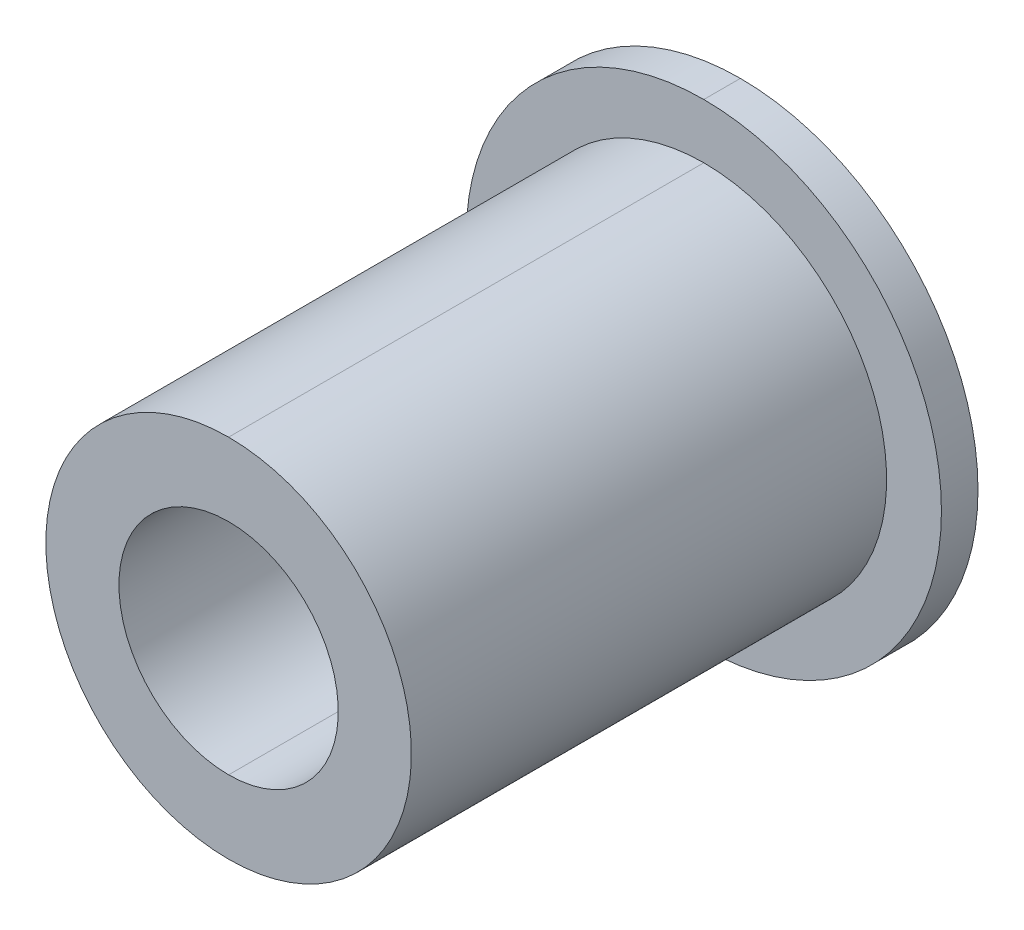
ISO-10303-21;
HEADER;
FILE_DESCRIPTION(('STEP AP214'),'2;1');
FILE_NAME('part.step','',(''),(''),'','','');
FILE_SCHEMA(('AUTOMOTIVE_DESIGN { 1 0 10303 214 1 1 1 1 }'));
ENDSEC;
DATA;
#1=APPLICATION_CONTEXT('core data for automotive mechanical design processes');
#2=APPLICATION_PROTOCOL_DEFINITION('international standard','automotive_design',2000,#1);
#3=PRODUCT_CONTEXT('',#1,'mechanical');
#4=PRODUCT('Part','Part','',(#3));
#5=PRODUCT_RELATED_PRODUCT_CATEGORY('part','',(#4));
#6=PRODUCT_DEFINITION_FORMATION('','',#4);
#7=PRODUCT_DEFINITION_CONTEXT('part definition',#1,'design');
#8=PRODUCT_DEFINITION('design','',#6,#7);
#9=PRODUCT_DEFINITION_SHAPE('','',#8);
#10=(LENGTH_UNIT() NAMED_UNIT(*) SI_UNIT(.MILLI.,.METRE.));
#11=(NAMED_UNIT(*) PLANE_ANGLE_UNIT() SI_UNIT($,.RADIAN.));
#12=(NAMED_UNIT(*) SI_UNIT($,.STERADIAN.) SOLID_ANGLE_UNIT());
#13=UNCERTAINTY_MEASURE_WITH_UNIT(LENGTH_MEASURE(1.E-05),#10,'distance_accuracy_value','');
#14=(GEOMETRIC_REPRESENTATION_CONTEXT(3) GLOBAL_UNCERTAINTY_ASSIGNED_CONTEXT((#13)) GLOBAL_UNIT_ASSIGNED_CONTEXT((#10,
#11,#12)) REPRESENTATION_CONTEXT('',''));
#15=CARTESIAN_POINT('',(0.,0.,0.));
#16=DIRECTION('',(0.,0.,1.));
#17=DIRECTION('',(1.,0.,0.));
#18=AXIS2_PLACEMENT_3D('',#15,#16,#17);
#19=CARTESIAN_POINT('',(-289.4338306998,295.4245773803,-6.700000380954));
#20=DIRECTION('',(0.,0.,-1.));
#21=DIRECTION('',(0.,-1.,0.));
#22=AXIS2_PLACEMENT_3D('',#19,#20,#21);
#23=PLANE('',#22);
#24=CARTESIAN_POINT('',(-289.4338306998,296.1745773803,-6.700000380954));
#25=DIRECTION('',(0.,0.,1.));
#26=DIRECTION('',(0.,1.,0.));
#27=AXIS2_PLACEMENT_3D('',#24,#25,#26);
#28=CIRCLE('',#27,1.5);
#29=CARTESIAN_POINT('',(-289.4338306998,297.6745773803,-6.700000380954));
#30=VERTEX_POINT('',#29);
#31=CARTESIAN_POINT('',(-289.4338306998,294.6745773803,-6.700000380954));
#32=VERTEX_POINT('',#31);
#33=EDGE_CURVE('E11',#30,#32,#28,.T.);
#34=ORIENTED_EDGE('',*,*,#33,.T.);
#35=CARTESIAN_POINT('',(-289.4338306998,296.1745773803,-6.700000380954));
#36=DIRECTION('',(0.,0.,1.));
#37=DIRECTION('',(0.,-1.,0.));
#38=AXIS2_PLACEMENT_3D('',#35,#36,#37);
#39=CIRCLE('',#38,1.5);
#40=EDGE_CURVE('E52',#32,#30,#39,.T.);
#41=ORIENTED_EDGE('',*,*,#40,.T.);
#42=EDGE_LOOP('',(#34,#41));
#43=FACE_BOUND('',#42,.T.);
#44=ADVANCED_FACE('F17',(#43),#23,.F.);
#45=CARTESIAN_POINT('',(-289.4338306998,296.1745773803,-1.600000380954));
#46=DIRECTION('',(0.,0.,-1.));
#47=DIRECTION('',(0.,-1.,0.));
#48=AXIS2_PLACEMENT_3D('',#45,#46,#47);
#49=CYLINDRICAL_SURFACE('',#48,1.5);
#50=ORIENTED_EDGE('',*,*,#33,.F.);
#51=DIRECTION('',(0.,0.,1.));
#52=VECTOR('',#51,1.);
#53=CARTESIAN_POINT('',(-289.4338306998,297.6745773803,-6.700000380954));
#54=LINE('',#53,#52);
#55=CARTESIAN_POINT('',(-289.4338306998,297.6745773803,0.1999996190464));
#56=VERTEX_POINT('',#55);
#57=EDGE_CURVE('E44',#30,#56,#54,.T.);
#58=ORIENTED_EDGE('',*,*,#57,.T.);
#59=CARTESIAN_POINT('',(-289.4338306998,296.1745773803,0.1999996190464));
#60=DIRECTION('',(0.,0.,-1.));
#61=DIRECTION('',(0.,-1.,0.));
#62=AXIS2_PLACEMENT_3D('',#59,#60,#61);
#63=CIRCLE('',#62,1.5);
#64=CARTESIAN_POINT('',(-289.4338306998,294.6745773803,0.1999996190464));
#65=VERTEX_POINT('',#64);
#66=EDGE_CURVE('E48',#65,#56,#63,.T.);
#67=ORIENTED_EDGE('',*,*,#66,.F.);
#68=DIRECTION('',(0.,0.,1.));
#69=VECTOR('',#68,1.);
#70=CARTESIAN_POINT('',(-289.4338306998,294.6745773803,-6.700000380954));
#71=LINE('',#70,#69);
#72=EDGE_CURVE('E26',#32,#65,#71,.T.);
#73=ORIENTED_EDGE('',*,*,#72,.F.);
#74=EDGE_LOOP('',(#50,#58,#67,#73));
#75=FACE_BOUND('',#74,.T.);
#76=ADVANCED_FACE('F46',(#75),#49,.F.);
#77=CARTESIAN_POINT('',(-289.4338306998,296.1745773803,-1.600000380954));
#78=DIRECTION('',(0.,0.,-1.));
#79=DIRECTION('',(0.,-1.,0.));
#80=AXIS2_PLACEMENT_3D('',#77,#78,#79);
#81=CYLINDRICAL_SURFACE('',#80,1.5);
#82=CARTESIAN_POINT('',(-289.4338306998,296.1745773803,0.1999996190464));
#83=DIRECTION('',(0.,0.,-1.));
#84=DIRECTION('',(0.,1.,0.));
#85=AXIS2_PLACEMENT_3D('',#82,#83,#84);
#86=CIRCLE('',#85,1.5);
#87=EDGE_CURVE('E53',#56,#65,#86,.T.);
#88=ORIENTED_EDGE('',*,*,#87,.F.);
#89=ORIENTED_EDGE('',*,*,#57,.F.);
#90=ORIENTED_EDGE('',*,*,#40,.F.);
#91=ORIENTED_EDGE('',*,*,#72,.T.);
#92=EDGE_LOOP('',(#88,#89,#90,#91));
#93=FACE_BOUND('',#92,.T.);
#94=ADVANCED_FACE('F56',(#93),#81,.F.);
#95=CARTESIAN_POINT('',(-289.4338306998,296.1745773803,-2.300000380954));
#96=DIRECTION('',(0.,0.,-1.));
#97=DIRECTION('',(0.,-1.,0.));
#98=AXIS2_PLACEMENT_3D('',#95,#96,#97);
#99=CYLINDRICAL_SURFACE('',#98,2.5);
#100=CARTESIAN_POINT('',(-289.4338306998,296.1745773803,0.1999996190464));
#101=DIRECTION('',(0.,0.,1.));
#102=DIRECTION('',(0.,1.,0.));
#103=AXIS2_PLACEMENT_3D('',#100,#101,#102);
#104=CIRCLE('',#103,2.5);
#105=CARTESIAN_POINT('',(-289.4338306998,298.6745773803,0.1999996190464));
#106=VERTEX_POINT('',#105);
#107=CARTESIAN_POINT('',(-289.4338306998,293.6745773803,0.1999996190464));
#108=VERTEX_POINT('',#107);
#109=EDGE_CURVE('E63',#106,#108,#104,.T.);
#110=ORIENTED_EDGE('',*,*,#109,.F.);
#111=DIRECTION('',(0.,0.,1.));
#112=VECTOR('',#111,1.);
#113=CARTESIAN_POINT('',(-289.4338306998,298.6745773803,-6.300000380954));
#114=LINE('',#113,#112);
#115=CARTESIAN_POINT('',(-289.4338306998,298.6745773803,-6.300000380954));
#116=VERTEX_POINT('',#115);
#117=EDGE_CURVE('E154',#116,#106,#114,.T.);
#118=ORIENTED_EDGE('',*,*,#117,.F.);
#119=CARTESIAN_POINT('',(-289.4338306998,296.1745773803,-6.300000380954));
#120=DIRECTION('',(0.,0.,-1.));
#121=DIRECTION('',(0.,-1.,0.));
#122=AXIS2_PLACEMENT_3D('',#119,#120,#121);
#123=CIRCLE('',#122,2.5);
#124=CARTESIAN_POINT('',(-289.4338306998,293.6745773803,-6.300000380954));
#125=VERTEX_POINT('',#124);
#126=EDGE_CURVE('E158',#125,#116,#123,.T.);
#127=ORIENTED_EDGE('',*,*,#126,.F.);
#128=DIRECTION('',(0.,0.,1.));
#129=VECTOR('',#128,1.);
#130=CARTESIAN_POINT('',(-289.4338306998,293.6745773803,-6.300000380954));
#131=LINE('',#130,#129);
#132=EDGE_CURVE('E150',#125,#108,#131,.T.);
#133=ORIENTED_EDGE('',*,*,#132,.T.);
#134=EDGE_LOOP('',(#110,#118,#127,#133));
#135=FACE_BOUND('',#134,.T.);
#136=ADVANCED_FACE('F87',(#135),#99,.T.);
#137=CARTESIAN_POINT('',(-289.4338306998,294.1745773803,0.1999996190464));
#138=DIRECTION('',(0.,0.,-1.));
#139=DIRECTION('',(0.,-1.,0.));
#140=AXIS2_PLACEMENT_3D('',#137,#138,#139);
#141=PLANE('',#140);
#142=ORIENTED_EDGE('',*,*,#66,.T.);
#143=ORIENTED_EDGE('',*,*,#87,.T.);
#144=EDGE_LOOP('',(#142,#143));
#145=FACE_BOUND('',#144,.T.);
#146=ORIENTED_EDGE('',*,*,#109,.T.);
#147=CARTESIAN_POINT('',(-289.4338306998,296.1745773803,0.1999996190464));
#148=DIRECTION('',(0.,0.,1.));
#149=DIRECTION('',(0.,-1.,0.));
#150=AXIS2_PLACEMENT_3D('',#147,#148,#149);
#151=CIRCLE('',#150,2.5);
#152=EDGE_CURVE('E71',#108,#106,#151,.T.);
#153=ORIENTED_EDGE('',*,*,#152,.T.);
#154=EDGE_LOOP('',(#146,#153));
#155=FACE_BOUND('',#154,.T.);
#156=ADVANCED_FACE('F60',(#145,#155),#141,.F.);
#157=CARTESIAN_POINT('',(-289.4338306998,296.1745773803,-2.300000380954));
#158=DIRECTION('',(0.,0.,-1.));
#159=DIRECTION('',(0.,-1.,0.));
#160=AXIS2_PLACEMENT_3D('',#157,#158,#159);
#161=CYLINDRICAL_SURFACE('',#160,2.5);
#162=ORIENTED_EDGE('',*,*,#132,.F.);
#163=CARTESIAN_POINT('',(-289.4338306998,296.1745773803,-6.300000380954));
#164=DIRECTION('',(0.,0.,-1.));
#165=DIRECTION('',(0.,1.,0.));
#166=AXIS2_PLACEMENT_3D('',#163,#164,#165);
#167=CIRCLE('',#166,2.5);
#168=EDGE_CURVE('E137',#116,#125,#167,.T.);
#169=ORIENTED_EDGE('',*,*,#168,.F.);
#170=ORIENTED_EDGE('',*,*,#117,.T.);
#171=ORIENTED_EDGE('',*,*,#152,.F.);
#172=EDGE_LOOP('',(#162,#169,#170,#171));
#173=FACE_BOUND('',#172,.T.);
#174=ADVANCED_FACE('F94',(#173),#161,.T.);
#175=CARTESIAN_POINT('',(-289.4338306998,296.1745773803,-7.300000380954));
#176=DIRECTION('',(0.,0.,-1.));
#177=DIRECTION('',(0.,-1.,0.));
#178=AXIS2_PLACEMENT_3D('',#175,#176,#177);
#179=CYLINDRICAL_SURFACE('',#178,3.25);
#180=CARTESIAN_POINT('',(-289.4338306998,296.1745773803,-6.300000380954));
#181=DIRECTION('',(0.,0.,1.));
#182=DIRECTION('',(0.,1.,0.));
#183=AXIS2_PLACEMENT_3D('',#180,#181,#182);
#184=CIRCLE('',#183,3.25);
#185=CARTESIAN_POINT('',(-289.4338306998,299.4245773803,-6.300000380954));
#186=VERTEX_POINT('',#185);
#187=CARTESIAN_POINT('',(-289.4338306998,292.9245773803,-6.300000380954));
#188=VERTEX_POINT('',#187);
#189=EDGE_CURVE('E149',#186,#188,#184,.T.);
#190=ORIENTED_EDGE('',*,*,#189,.F.);
#191=DIRECTION('',(0.,0.,1.));
#192=VECTOR('',#191,1.);
#193=CARTESIAN_POINT('',(-289.4338306998,299.4245773803,-6.800000380954));
#194=LINE('',#193,#192);
#195=CARTESIAN_POINT('',(-289.4338306998,299.4245773803,-6.800000380954));
#196=VERTEX_POINT('',#195);
#197=EDGE_CURVE('E141',#196,#186,#194,.T.);
#198=ORIENTED_EDGE('',*,*,#197,.F.);
#199=CARTESIAN_POINT('',(-289.4338306998,296.1745773803,-6.800000380954));
#200=DIRECTION('',(0.,0.,-1.));
#201=DIRECTION('',(0.,-1.,0.));
#202=AXIS2_PLACEMENT_3D('',#199,#200,#201);
#203=CIRCLE('',#202,3.25);
#204=CARTESIAN_POINT('',(-289.4338306998,292.9245773803,-6.800000380954));
#205=VERTEX_POINT('',#204);
#206=EDGE_CURVE('E120',#205,#196,#203,.T.);
#207=ORIENTED_EDGE('',*,*,#206,.F.);
#208=DIRECTION('',(0.,0.,1.));
#209=VECTOR('',#208,1.);
#210=CARTESIAN_POINT('',(-289.4338306998,292.9245773803,-6.800000380954));
#211=LINE('',#210,#209);
#212=EDGE_CURVE('E134',#205,#188,#211,.T.);
#213=ORIENTED_EDGE('',*,*,#212,.T.);
#214=EDGE_LOOP('',(#190,#198,#207,#213));
#215=FACE_BOUND('',#214,.T.);
#216=ADVANCED_FACE('F96',(#215),#179,.T.);
#217=CARTESIAN_POINT('',(-289.4338306998,293.1745773803,-6.300000380954));
#218=DIRECTION('',(0.,0.,-1.));
#219=DIRECTION('',(0.,-1.,0.));
#220=AXIS2_PLACEMENT_3D('',#217,#218,#219);
#221=PLANE('',#220);
#222=ORIENTED_EDGE('',*,*,#126,.T.);
#223=ORIENTED_EDGE('',*,*,#168,.T.);
#224=EDGE_LOOP('',(#222,#223));
#225=FACE_BOUND('',#224,.T.);
#226=ORIENTED_EDGE('',*,*,#189,.T.);
#227=CARTESIAN_POINT('',(-289.4338306998,296.1745773803,-6.300000380954));
#228=DIRECTION('',(0.,0.,1.));
#229=DIRECTION('',(0.,-1.,0.));
#230=AXIS2_PLACEMENT_3D('',#227,#228,#229);
#231=CIRCLE('',#230,3.25);
#232=EDGE_CURVE('E145',#188,#186,#231,.T.);
#233=ORIENTED_EDGE('',*,*,#232,.T.);
#234=EDGE_LOOP('',(#226,#233));
#235=FACE_BOUND('',#234,.T.);
#236=ADVANCED_FACE('F99',(#225,#235),#221,.F.);
#237=CARTESIAN_POINT('',(-289.4338306998,296.1745773803,-7.300000380954));
#238=DIRECTION('',(0.,0.,-1.));
#239=DIRECTION('',(0.,-1.,0.));
#240=AXIS2_PLACEMENT_3D('',#237,#238,#239);
#241=CYLINDRICAL_SURFACE('',#240,3.25);
#242=ORIENTED_EDGE('',*,*,#212,.F.);
#243=CARTESIAN_POINT('',(-289.4338306998,296.1745773803,-6.800000380954));
#244=DIRECTION('',(0.,0.,-1.));
#245=DIRECTION('',(0.,1.,0.));
#246=AXIS2_PLACEMENT_3D('',#243,#244,#245);
#247=CIRCLE('',#246,3.25);
#248=EDGE_CURVE('E123',#196,#205,#247,.T.);
#249=ORIENTED_EDGE('',*,*,#248,.F.);
#250=ORIENTED_EDGE('',*,*,#197,.T.);
#251=ORIENTED_EDGE('',*,*,#232,.F.);
#252=EDGE_LOOP('',(#242,#249,#250,#251));
#253=FACE_BOUND('',#252,.T.);
#254=ADVANCED_FACE('F103',(#253),#241,.T.);
#255=CARTESIAN_POINT('',(-520.4338307148,303.6445772562,-6.800000380954));
#256=DIRECTION('',(0.,0.,-1.));
#257=DIRECTION('',(0.,-1.,0.));
#258=AXIS2_PLACEMENT_3D('',#255,#256,#257);
#259=PLANE('',#258);
#260=ORIENTED_EDGE('',*,*,#206,.T.);
#261=ORIENTED_EDGE('',*,*,#248,.T.);
#262=EDGE_LOOP('',(#260,#261));
#263=FACE_BOUND('',#262,.T.);
#264=ADVANCED_FACE('F110',(#263),#259,.T.);
#265=CLOSED_SHELL('',(#44,#76,#94,#136,#156,#174,#216,#236,#254,#264));
#266=MANIFOLD_SOLID_BREP('B1',#265);
#267=ADVANCED_BREP_SHAPE_REPRESENTATION('',(#18,#266),#14);
#268=SHAPE_DEFINITION_REPRESENTATION(#9,#267);
ENDSEC;
END-ISO-10303-21;
